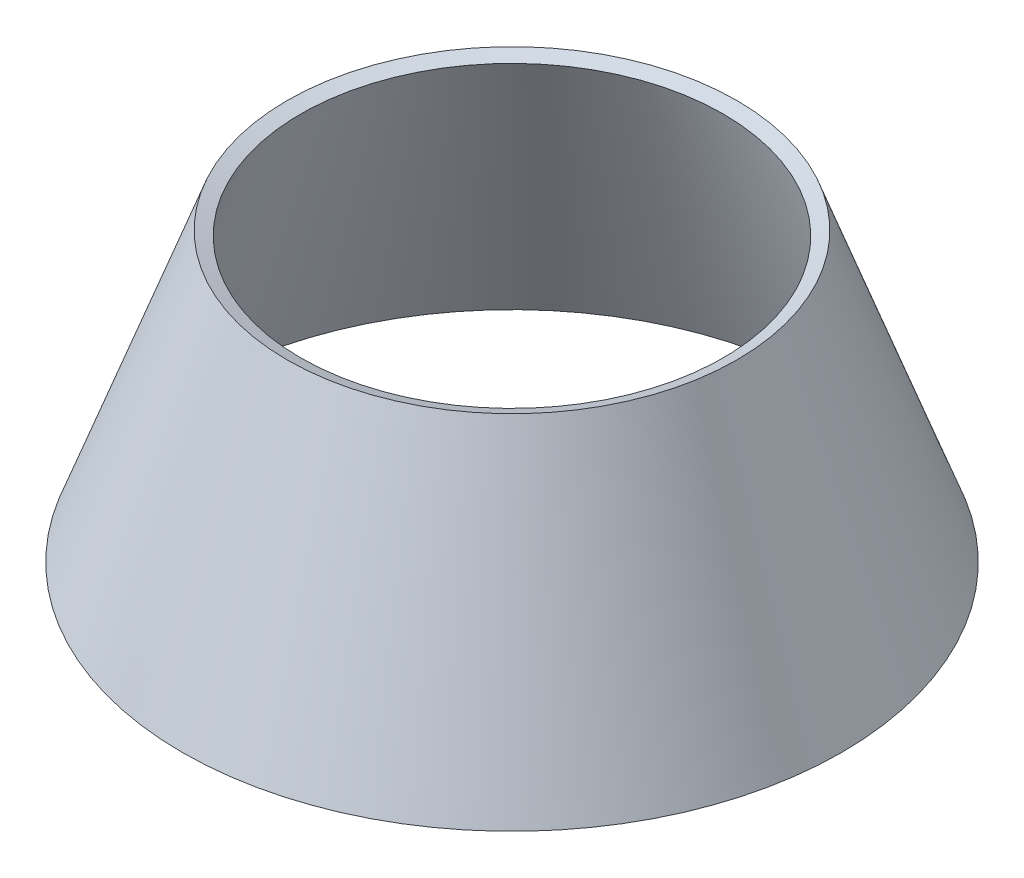
ISO-10303-21;
HEADER;
FILE_DESCRIPTION(('STEP AP214'),'2;1');
FILE_NAME('part.step','',(''),(''),'','','');
FILE_SCHEMA(('AUTOMOTIVE_DESIGN { 1 0 10303 214 1 1 1 1 }'));
ENDSEC;
DATA;
#1=APPLICATION_CONTEXT('core data for automotive mechanical design processes');
#2=APPLICATION_PROTOCOL_DEFINITION('international standard','automotive_design',2000,#1);
#3=PRODUCT_CONTEXT('',#1,'mechanical');
#4=PRODUCT('Part','Part','',(#3));
#5=PRODUCT_RELATED_PRODUCT_CATEGORY('part','',(#4));
#6=PRODUCT_DEFINITION_FORMATION('','',#4);
#7=PRODUCT_DEFINITION_CONTEXT('part definition',#1,'design');
#8=PRODUCT_DEFINITION('design','',#6,#7);
#9=PRODUCT_DEFINITION_SHAPE('','',#8);
#10=(LENGTH_UNIT() NAMED_UNIT(*) SI_UNIT(.MILLI.,.METRE.));
#11=(NAMED_UNIT(*) PLANE_ANGLE_UNIT() SI_UNIT($,.RADIAN.));
#12=(NAMED_UNIT(*) SI_UNIT($,.STERADIAN.) SOLID_ANGLE_UNIT());
#13=UNCERTAINTY_MEASURE_WITH_UNIT(LENGTH_MEASURE(1.E-05),#10,'distance_accuracy_value','');
#14=(GEOMETRIC_REPRESENTATION_CONTEXT(3) GLOBAL_UNCERTAINTY_ASSIGNED_CONTEXT((#13)) GLOBAL_UNIT_ASSIGNED_CONTEXT((#10,
#11,#12)) REPRESENTATION_CONTEXT('',''));
#15=CARTESIAN_POINT('',(0.,0.,0.));
#16=DIRECTION('',(0.,0.,1.));
#17=DIRECTION('',(1.,0.,0.));
#18=AXIS2_PLACEMENT_3D('',#15,#16,#17);
#19=CARTESIAN_POINT('',(0.,0.514311280694979,0.));
#20=DIRECTION('',(0.,-1.,0.));
#21=DIRECTION('',(0.,0.,-1.));
#22=AXIS2_PLACEMENT_3D('',#19,#20,#21);
#23=CONICAL_SURFACE('',#22,34.4090720019041,0.34997485532979);
#24=CARTESIAN_POINT('',(0.,30.514311280695,0.));
#25=DIRECTION('',(0.,-1.,0.));
#26=DIRECTION('',(0.,0.,-1.));
#27=AXIS2_PLACEMENT_3D('',#24,#25,#26);
#28=CIRCLE('',#27,23.459072001904);
#29=CARTESIAN_POINT('',(0.,30.514311280695,-23.459072001904));
#30=VERTEX_POINT('',#29);
#31=EDGE_CURVE('E48',#30,#30,#28,.T.);
#32=ORIENTED_EDGE('',*,*,#31,.T.);
#33=EDGE_LOOP('',(#32));
#34=FACE_BOUND('',#33,.T.);
#35=CARTESIAN_POINT('',(0.,0.514311280694979,0.));
#36=DIRECTION('',(0.,-1.,0.));
#37=DIRECTION('',(0.,0.,-1.));
#38=AXIS2_PLACEMENT_3D('',#35,#36,#37);
#39=CIRCLE('',#38,34.4090720019041);
#40=CARTESIAN_POINT('',(0.,0.514311280694979,-34.4090720019041));
#41=VERTEX_POINT('',#40);
#42=EDGE_CURVE('E10',#41,#41,#39,.T.);
#43=ORIENTED_EDGE('',*,*,#42,.F.);
#44=EDGE_LOOP('',(#43));
#45=FACE_BOUND('',#44,.T.);
#46=ADVANCED_FACE('F34',(#34,#45),#23,.T.);
#47=CARTESIAN_POINT('',(0.,0.514311280694979,0.));
#48=DIRECTION('',(0.,1.,0.));
#49=DIRECTION('',(0.,0.,1.));
#50=AXIS2_PLACEMENT_3D('',#47,#48,#49);
#51=CONICAL_SURFACE('',#50,34.4090720019041,1.22082147146511);
#52=CARTESIAN_POINT('',(0.,0.,0.));
#53=DIRECTION('',(0.,-1.,0.));
#54=DIRECTION('',(0.,0.,-1.));
#55=AXIS2_PLACEMENT_3D('',#52,#53,#54);
#56=CIRCLE('',#55,33.);
#57=CARTESIAN_POINT('',(0.,0.,-33.));
#58=VERTEX_POINT('',#57);
#59=EDGE_CURVE('E40',#58,#58,#56,.T.);
#60=ORIENTED_EDGE('',*,*,#59,.F.);
#61=EDGE_LOOP('',(#60));
#62=FACE_BOUND('',#61,.T.);
#63=ORIENTED_EDGE('',*,*,#42,.T.);
#64=EDGE_LOOP('',(#63));
#65=FACE_BOUND('',#64,.T.);
#66=ADVANCED_FACE('F64',(#62,#65),#51,.T.);
#67=CARTESIAN_POINT('',(0.,0.,0.));
#68=DIRECTION('',(0.,-1.,0.));
#69=DIRECTION('',(0.,0.,-1.));
#70=AXIS2_PLACEMENT_3D('',#67,#68,#69);
#71=CONICAL_SURFACE('',#70,33.,0.34997485532979);
#72=CARTESIAN_POINT('',(0.,30.,0.));
#73=DIRECTION('',(0.,-1.,0.));
#74=DIRECTION('',(0.,0.,-1.));
#75=AXIS2_PLACEMENT_3D('',#72,#73,#74);
#76=CIRCLE('',#75,22.05);
#77=CARTESIAN_POINT('',(0.,30.,-22.05));
#78=VERTEX_POINT('',#77);
#79=EDGE_CURVE('E44',#78,#78,#76,.T.);
#80=ORIENTED_EDGE('',*,*,#79,.F.);
#81=EDGE_LOOP('',(#80));
#82=FACE_BOUND('',#81,.T.);
#83=ORIENTED_EDGE('',*,*,#59,.T.);
#84=EDGE_LOOP('',(#83));
#85=FACE_BOUND('',#84,.T.);
#86=ADVANCED_FACE('F59',(#82,#85),#71,.F.);
#87=CARTESIAN_POINT('',(0.,30.,0.));
#88=DIRECTION('',(0.,1.,0.));
#89=DIRECTION('',(0.,0.,1.));
#90=AXIS2_PLACEMENT_3D('',#87,#88,#89);
#91=CONICAL_SURFACE('',#90,22.05,1.2208214714651);
#92=ORIENTED_EDGE('',*,*,#31,.F.);
#93=EDGE_LOOP('',(#92));
#94=FACE_BOUND('',#93,.T.);
#95=ORIENTED_EDGE('',*,*,#79,.T.);
#96=EDGE_LOOP('',(#95));
#97=FACE_BOUND('',#96,.T.);
#98=ADVANCED_FACE('F56',(#94,#97),#91,.F.);
#99=CLOSED_SHELL('',(#46,#66,#86,#98));
#100=MANIFOLD_SOLID_BREP('B2',#99);
#101=ADVANCED_BREP_SHAPE_REPRESENTATION('',(#18,#100),#14);
#102=SHAPE_DEFINITION_REPRESENTATION(#9,#101);
ENDSEC;
END-ISO-10303-21;
